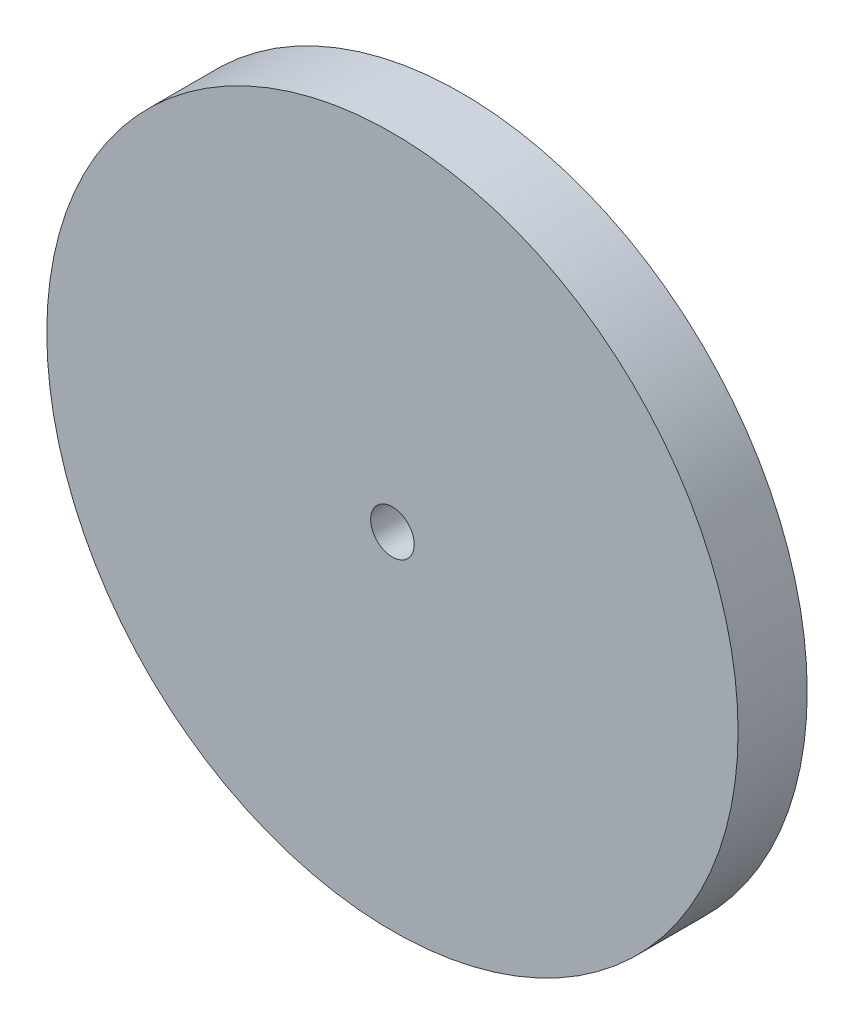
ISO-10303-21;
HEADER;
FILE_DESCRIPTION(('STEP AP214'),'2;1');
FILE_NAME('part.step','',(''),(''),'','','');
FILE_SCHEMA(('AUTOMOTIVE_DESIGN { 1 0 10303 214 1 1 1 1 }'));
ENDSEC;
DATA;
#1=APPLICATION_CONTEXT('core data for automotive mechanical design processes');
#2=APPLICATION_PROTOCOL_DEFINITION('international standard','automotive_design',2000,#1);
#3=PRODUCT_CONTEXT('',#1,'mechanical');
#4=PRODUCT('Part','Part','',(#3));
#5=PRODUCT_RELATED_PRODUCT_CATEGORY('part','',(#4));
#6=PRODUCT_DEFINITION_FORMATION('','',#4);
#7=PRODUCT_DEFINITION_CONTEXT('part definition',#1,'design');
#8=PRODUCT_DEFINITION('design','',#6,#7);
#9=PRODUCT_DEFINITION_SHAPE('','',#8);
#10=(LENGTH_UNIT() NAMED_UNIT(*) SI_UNIT(.MILLI.,.METRE.));
#11=(NAMED_UNIT(*) PLANE_ANGLE_UNIT() SI_UNIT($,.RADIAN.));
#12=(NAMED_UNIT(*) SI_UNIT($,.STERADIAN.) SOLID_ANGLE_UNIT());
#13=UNCERTAINTY_MEASURE_WITH_UNIT(LENGTH_MEASURE(1.E-05),#10,'distance_accuracy_value','');
#14=(GEOMETRIC_REPRESENTATION_CONTEXT(3) GLOBAL_UNCERTAINTY_ASSIGNED_CONTEXT((#13)) GLOBAL_UNIT_ASSIGNED_CONTEXT((#10,
#11,#12)) REPRESENTATION_CONTEXT('',''));
#15=CARTESIAN_POINT('',(0.,0.,0.));
#16=DIRECTION('',(0.,0.,1.));
#17=DIRECTION('',(1.,0.,0.));
#18=AXIS2_PLACEMENT_3D('',#15,#16,#17);
#19=CARTESIAN_POINT('',(0.,0.,12.7));
#20=DIRECTION('',(0.,0.,1.));
#21=DIRECTION('',(1.,0.,0.));
#22=AXIS2_PLACEMENT_3D('',#19,#20,#21);
#23=PLANE('',#22);
#24=CARTESIAN_POINT('',(0.,0.,12.7));
#25=DIRECTION('',(0.,0.,1.));
#26=DIRECTION('',(1.,0.,0.));
#27=AXIS2_PLACEMENT_3D('',#24,#25,#26);
#28=CIRCLE('',#27,63.5);
#29=CARTESIAN_POINT('',(63.5,0.,12.7));
#30=VERTEX_POINT('',#29);
#31=EDGE_CURVE('E10',#30,#30,#28,.T.);
#32=ORIENTED_EDGE('',*,*,#31,.T.);
#33=EDGE_LOOP('',(#32));
#34=FACE_BOUND('',#33,.T.);
#35=CARTESIAN_POINT('',(0.,0.,12.7));
#36=DIRECTION('',(0.,0.,1.));
#37=DIRECTION('',(1.,0.,0.));
#38=AXIS2_PLACEMENT_3D('',#35,#36,#37);
#39=CIRCLE('',#38,4.);
#40=CARTESIAN_POINT('',(4.,0.,12.7));
#41=VERTEX_POINT('',#40);
#42=EDGE_CURVE('E43',#41,#41,#39,.T.);
#43=ORIENTED_EDGE('',*,*,#42,.F.);
#44=EDGE_LOOP('',(#43));
#45=FACE_BOUND('',#44,.T.);
#46=ADVANCED_FACE('F32',(#34,#45),#23,.T.);
#47=CARTESIAN_POINT('',(0.,0.,0.));
#48=DIRECTION('',(0.,0.,1.));
#49=DIRECTION('',(1.,0.,0.));
#50=AXIS2_PLACEMENT_3D('',#47,#48,#49);
#51=PLANE('',#50);
#52=CARTESIAN_POINT('',(0.,0.,0.));
#53=DIRECTION('',(0.,0.,1.));
#54=DIRECTION('',(1.,0.,0.));
#55=AXIS2_PLACEMENT_3D('',#52,#53,#54);
#56=CIRCLE('',#55,63.5);
#57=CARTESIAN_POINT('',(63.5,0.,0.));
#58=VERTEX_POINT('',#57);
#59=EDGE_CURVE('E36',#58,#58,#56,.T.);
#60=ORIENTED_EDGE('',*,*,#59,.F.);
#61=EDGE_LOOP('',(#60));
#62=FACE_BOUND('',#61,.T.);
#63=CARTESIAN_POINT('',(0.,0.,0.));
#64=DIRECTION('',(0.,0.,1.));
#65=DIRECTION('',(1.,0.,0.));
#66=AXIS2_PLACEMENT_3D('',#63,#64,#65);
#67=CIRCLE('',#66,4.);
#68=CARTESIAN_POINT('',(4.,0.,0.));
#69=VERTEX_POINT('',#68);
#70=EDGE_CURVE('E45',#69,#69,#67,.T.);
#71=ORIENTED_EDGE('',*,*,#70,.T.);
#72=EDGE_LOOP('',(#71));
#73=FACE_BOUND('',#72,.T.);
#74=ADVANCED_FACE('F55',(#62,#73),#51,.F.);
#75=CARTESIAN_POINT('',(0.,0.,12.7));
#76=DIRECTION('',(0.,0.,-1.));
#77=DIRECTION('',(-1.,0.,0.));
#78=AXIS2_PLACEMENT_3D('',#75,#76,#77);
#79=CYLINDRICAL_SURFACE('',#78,63.5);
#80=ORIENTED_EDGE('',*,*,#31,.F.);
#81=EDGE_LOOP('',(#80));
#82=FACE_BOUND('',#81,.T.);
#83=ORIENTED_EDGE('',*,*,#59,.T.);
#84=EDGE_LOOP('',(#83));
#85=FACE_BOUND('',#84,.T.);
#86=ADVANCED_FACE('F34',(#82,#85),#79,.T.);
#87=CARTESIAN_POINT('',(0.,0.,12.7));
#88=DIRECTION('',(0.,0.,-1.));
#89=DIRECTION('',(-1.,0.,0.));
#90=AXIS2_PLACEMENT_3D('',#87,#88,#89);
#91=CYLINDRICAL_SURFACE('',#90,4.);
#92=ORIENTED_EDGE('',*,*,#42,.T.);
#93=EDGE_LOOP('',(#92));
#94=FACE_BOUND('',#93,.T.);
#95=ORIENTED_EDGE('',*,*,#70,.F.);
#96=EDGE_LOOP('',(#95));
#97=FACE_BOUND('',#96,.T.);
#98=ADVANCED_FACE('F51',(#94,#97),#91,.F.);
#99=CLOSED_SHELL('',(#46,#74,#86,#98));
#100=MANIFOLD_SOLID_BREP('B2',#99);
#101=ADVANCED_BREP_SHAPE_REPRESENTATION('',(#18,#100),#14);
#102=SHAPE_DEFINITION_REPRESENTATION(#9,#101);
ENDSEC;
END-ISO-10303-21;
